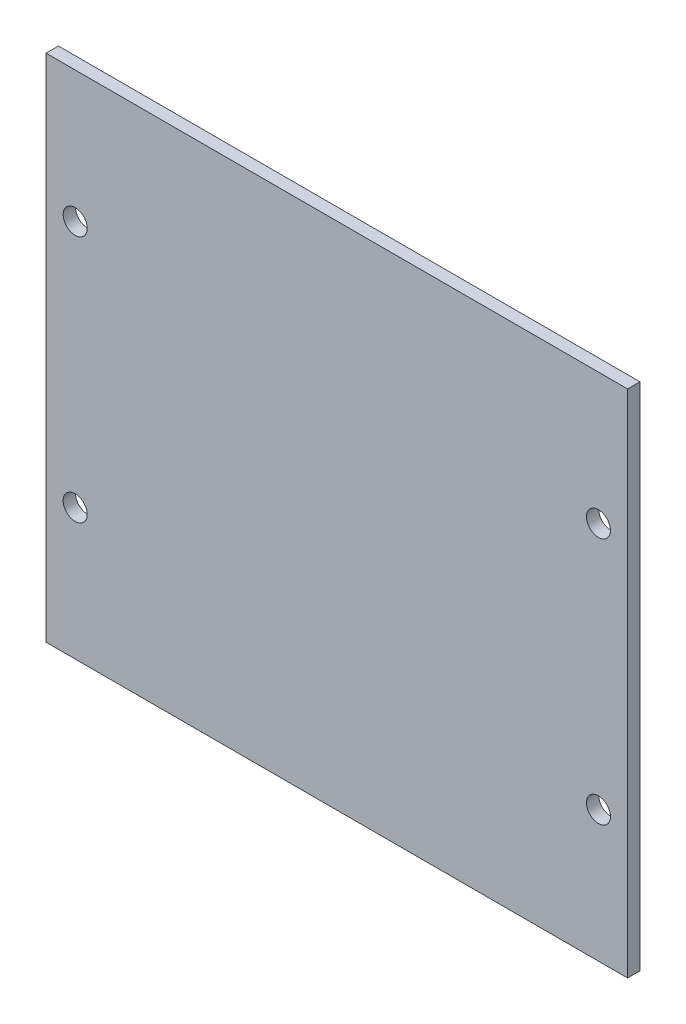
ISO-10303-21;
HEADER;
FILE_DESCRIPTION(('STEP AP214'),'2;1');
FILE_NAME('part.step','',(''),(''),'','','');
FILE_SCHEMA(('AUTOMOTIVE_DESIGN { 1 0 10303 214 1 1 1 1 }'));
ENDSEC;
DATA;
#1=APPLICATION_CONTEXT('core data for automotive mechanical design processes');
#2=APPLICATION_PROTOCOL_DEFINITION('international standard','automotive_design',2000,#1);
#3=PRODUCT_CONTEXT('',#1,'mechanical');
#4=PRODUCT('Part','Part','',(#3));
#5=PRODUCT_RELATED_PRODUCT_CATEGORY('part','',(#4));
#6=PRODUCT_DEFINITION_FORMATION('','',#4);
#7=PRODUCT_DEFINITION_CONTEXT('part definition',#1,'design');
#8=PRODUCT_DEFINITION('design','',#6,#7);
#9=PRODUCT_DEFINITION_SHAPE('','',#8);
#10=(LENGTH_UNIT() NAMED_UNIT(*) SI_UNIT(.MILLI.,.METRE.));
#11=(NAMED_UNIT(*) PLANE_ANGLE_UNIT() SI_UNIT($,.RADIAN.));
#12=(NAMED_UNIT(*) SI_UNIT($,.STERADIAN.) SOLID_ANGLE_UNIT());
#13=UNCERTAINTY_MEASURE_WITH_UNIT(LENGTH_MEASURE(1.E-05),#10,'distance_accuracy_value','');
#14=(GEOMETRIC_REPRESENTATION_CONTEXT(3) GLOBAL_UNCERTAINTY_ASSIGNED_CONTEXT((#13)) GLOBAL_UNIT_ASSIGNED_CONTEXT((#10,
#11,#12)) REPRESENTATION_CONTEXT('',''));
#15=CARTESIAN_POINT('',(0.,0.,0.));
#16=DIRECTION('',(0.,0.,1.));
#17=DIRECTION('',(1.,0.,0.));
#18=AXIS2_PLACEMENT_3D('',#15,#16,#17);
#19=CARTESIAN_POINT('',(0.,0.,0.));
#20=DIRECTION('',(0.,0.,-1.));
#21=DIRECTION('',(-1.,0.,0.));
#22=AXIS2_PLACEMENT_3D('',#19,#20,#21);
#23=PLANE('',#22);
#24=CARTESIAN_POINT('',(-35.9,17.,0.));
#25=DIRECTION('',(0.,0.,1.));
#26=DIRECTION('',(1.,0.,0.));
#27=AXIS2_PLACEMENT_3D('',#24,#25,#26);
#28=CIRCLE('',#27,1.65);
#29=CARTESIAN_POINT('',(-34.25,17.,0.));
#30=VERTEX_POINT('',#29);
#31=EDGE_CURVE('E429',#30,#30,#28,.T.);
#32=ORIENTED_EDGE('',*,*,#31,.T.);
#33=EDGE_LOOP('',(#32));
#34=FACE_BOUND('',#33,.T.);
#35=CARTESIAN_POINT('',(-35.9,-17.,0.));
#36=DIRECTION('',(0.,0.,-1.));
#37=DIRECTION('',(-1.,0.,0.));
#38=AXIS2_PLACEMENT_3D('',#35,#36,#37);
#39=CIRCLE('',#38,1.65);
#40=CARTESIAN_POINT('',(-37.55,-17.,0.));
#41=VERTEX_POINT('',#40);
#42=EDGE_CURVE('E444',#41,#41,#39,.T.);
#43=ORIENTED_EDGE('',*,*,#42,.F.);
#44=EDGE_LOOP('',(#43));
#45=FACE_BOUND('',#44,.T.);
#46=CARTESIAN_POINT('',(35.9,17.,0.));
#47=DIRECTION('',(0.,0.,-1.));
#48=DIRECTION('',(-1.,0.,0.));
#49=AXIS2_PLACEMENT_3D('',#46,#47,#48);
#50=CIRCLE('',#49,1.65);
#51=CARTESIAN_POINT('',(34.25,17.,0.));
#52=VERTEX_POINT('',#51);
#53=EDGE_CURVE('E434',#52,#52,#50,.T.);
#54=ORIENTED_EDGE('',*,*,#53,.F.);
#55=EDGE_LOOP('',(#54));
#56=FACE_BOUND('',#55,.T.);
#57=DIRECTION('',(0.,1.,0.));
#58=VECTOR('',#57,1.);
#59=CARTESIAN_POINT('',(-27.5,-13.95,0.));
#60=LINE('',#59,#58);
#61=CARTESIAN_POINT('',(-27.5,-13.95,0.));
#62=VERTEX_POINT('',#61);
#63=CARTESIAN_POINT('',(-27.5,-11.45,0.));
#64=VERTEX_POINT('',#63);
#65=EDGE_CURVE('E213',#62,#64,#60,.T.);
#66=ORIENTED_EDGE('',*,*,#65,.F.);
#67=DIRECTION('',(1.,0.,0.));
#68=VECTOR('',#67,1.);
#69=CARTESIAN_POINT('',(-27.5,-13.95,0.));
#70=LINE('',#69,#68);
#71=CARTESIAN_POINT('',(27.5,-13.95,0.));
#72=VERTEX_POINT('',#71);
#73=EDGE_CURVE('E192',#62,#72,#70,.T.);
#74=ORIENTED_EDGE('',*,*,#73,.T.);
#75=DIRECTION('',(0.,1.,0.));
#76=VECTOR('',#75,1.);
#77=CARTESIAN_POINT('',(27.5,-13.95,0.));
#78=LINE('',#77,#76);
#79=CARTESIAN_POINT('',(27.5,-11.45,0.));
#80=VERTEX_POINT('',#79);
#81=EDGE_CURVE('E186',#72,#80,#78,.T.);
#82=ORIENTED_EDGE('',*,*,#81,.T.);
#83=DIRECTION('',(1.,0.,0.));
#84=VECTOR('',#83,1.);
#85=CARTESIAN_POINT('',(-27.5,-11.45,0.));
#86=LINE('',#85,#84);
#87=EDGE_CURVE('E190',#64,#80,#86,.T.);
#88=ORIENTED_EDGE('',*,*,#87,.F.);
#89=EDGE_LOOP('',(#66,#74,#82,#88));
#90=FACE_BOUND('',#89,.T.);
#91=DIRECTION('',(1.,0.,0.));
#92=VECTOR('',#91,1.);
#93=CARTESIAN_POINT('',(-39.9,35.,0.));
#94=LINE('',#93,#92);
#95=CARTESIAN_POINT('',(-39.9,35.,0.));
#96=VERTEX_POINT('',#95);
#97=CARTESIAN_POINT('',(39.9,35.,0.));
#98=VERTEX_POINT('',#97);
#99=EDGE_CURVE('E351',#96,#98,#94,.T.);
#100=ORIENTED_EDGE('',*,*,#99,.T.);
#101=DIRECTION('',(0.,-1.,0.));
#102=VECTOR('',#101,1.);
#103=CARTESIAN_POINT('',(39.9,35.,0.));
#104=LINE('',#103,#102);
#105=CARTESIAN_POINT('',(39.9,-35.,0.));
#106=VERTEX_POINT('',#105);
#107=EDGE_CURVE('E381',#98,#106,#104,.T.);
#108=ORIENTED_EDGE('',*,*,#107,.T.);
#109=DIRECTION('',(1.,0.,0.));
#110=VECTOR('',#109,1.);
#111=CARTESIAN_POINT('',(-39.9,-35.,0.));
#112=LINE('',#111,#110);
#113=CARTESIAN_POINT('',(-39.9,-35.,0.));
#114=VERTEX_POINT('',#113);
#115=EDGE_CURVE('E384',#114,#106,#112,.T.);
#116=ORIENTED_EDGE('',*,*,#115,.F.);
#117=DIRECTION('',(0.,-1.,0.));
#118=VECTOR('',#117,1.);
#119=CARTESIAN_POINT('',(-39.9,35.,0.));
#120=LINE('',#119,#118);
#121=EDGE_CURVE('E366',#96,#114,#120,.T.);
#122=ORIENTED_EDGE('',*,*,#121,.F.);
#123=EDGE_LOOP('',(#100,#108,#116,#122));
#124=FACE_BOUND('',#123,.T.);
#125=DIRECTION('',(1.,0.,0.));
#126=VECTOR('',#125,1.);
#127=CARTESIAN_POINT('',(-27.5,13.95,0.));
#128=LINE('',#127,#126);
#129=CARTESIAN_POINT('',(-27.5,13.95,0.));
#130=VERTEX_POINT('',#129);
#131=CARTESIAN_POINT('',(27.5,13.95,0.));
#132=VERTEX_POINT('',#131);
#133=EDGE_CURVE('E322',#130,#132,#128,.T.);
#134=ORIENTED_EDGE('',*,*,#133,.F.);
#135=DIRECTION('',(0.,-1.,0.));
#136=VECTOR('',#135,1.);
#137=CARTESIAN_POINT('',(-27.5,13.95,0.));
#138=LINE('',#137,#136);
#139=CARTESIAN_POINT('',(-27.5,11.45,0.));
#140=VERTEX_POINT('',#139);
#141=EDGE_CURVE('E216',#130,#140,#138,.T.);
#142=ORIENTED_EDGE('',*,*,#141,.T.);
#143=DIRECTION('',(1.,0.,0.));
#144=VECTOR('',#143,1.);
#145=CARTESIAN_POINT('',(-27.5,11.45,0.));
#146=LINE('',#145,#144);
#147=CARTESIAN_POINT('',(27.5,11.45,0.));
#148=VERTEX_POINT('',#147);
#149=EDGE_CURVE('E337',#140,#148,#146,.T.);
#150=ORIENTED_EDGE('',*,*,#149,.T.);
#151=DIRECTION('',(0.,-1.,0.));
#152=VECTOR('',#151,1.);
#153=CARTESIAN_POINT('',(27.5,13.95,0.));
#154=LINE('',#153,#152);
#155=EDGE_CURVE('E340',#132,#148,#154,.T.);
#156=ORIENTED_EDGE('',*,*,#155,.F.);
#157=EDGE_LOOP('',(#134,#142,#150,#156));
#158=FACE_BOUND('',#157,.T.);
#159=DIRECTION('',(1.,0.,0.));
#160=VECTOR('',#159,1.);
#161=CARTESIAN_POINT('',(-27.5,18.95,0.));
#162=LINE('',#161,#160);
#163=CARTESIAN_POINT('',(-27.5,18.95,0.));
#164=VERTEX_POINT('',#163);
#165=CARTESIAN_POINT('',(27.5,18.95,0.));
#166=VERTEX_POINT('',#165);
#167=EDGE_CURVE('E253',#164,#166,#162,.T.);
#168=ORIENTED_EDGE('',*,*,#167,.F.);
#169=DIRECTION('',(0.,-1.,0.));
#170=VECTOR('',#169,1.);
#171=CARTESIAN_POINT('',(-27.5,18.95,0.));
#172=LINE('',#171,#170);
#173=CARTESIAN_POINT('',(-27.5,16.45,0.));
#174=VERTEX_POINT('',#173);
#175=EDGE_CURVE('E263',#164,#174,#172,.T.);
#176=ORIENTED_EDGE('',*,*,#175,.T.);
#177=DIRECTION('',(1.,0.,0.));
#178=VECTOR('',#177,1.);
#179=CARTESIAN_POINT('',(-27.5,16.45,0.));
#180=LINE('',#179,#178);
#181=CARTESIAN_POINT('',(27.5,16.45,0.));
#182=VERTEX_POINT('',#181);
#183=EDGE_CURVE('E257',#174,#182,#180,.T.);
#184=ORIENTED_EDGE('',*,*,#183,.T.);
#185=DIRECTION('',(0.,-1.,0.));
#186=VECTOR('',#185,1.);
#187=CARTESIAN_POINT('',(27.5,18.95,0.));
#188=LINE('',#187,#186);
#189=EDGE_CURVE('E254',#166,#182,#188,.T.);
#190=ORIENTED_EDGE('',*,*,#189,.F.);
#191=EDGE_LOOP('',(#168,#176,#184,#190));
#192=FACE_BOUND('',#191,.T.);
#193=DIRECTION('',(0.,1.,0.));
#194=VECTOR('',#193,1.);
#195=CARTESIAN_POINT('',(-27.5,-18.95,0.));
#196=LINE('',#195,#194);
#197=CARTESIAN_POINT('',(-27.5,-18.95,0.));
#198=VERTEX_POINT('',#197);
#199=CARTESIAN_POINT('',(-27.5,-16.45,0.));
#200=VERTEX_POINT('',#199);
#201=EDGE_CURVE('E294',#198,#200,#196,.T.);
#202=ORIENTED_EDGE('',*,*,#201,.F.);
#203=DIRECTION('',(1.,0.,0.));
#204=VECTOR('',#203,1.);
#205=CARTESIAN_POINT('',(-27.5,-18.95,0.));
#206=LINE('',#205,#204);
#207=CARTESIAN_POINT('',(27.5,-18.95,0.));
#208=VERTEX_POINT('',#207);
#209=EDGE_CURVE('E70',#198,#208,#206,.T.);
#210=ORIENTED_EDGE('',*,*,#209,.T.);
#211=DIRECTION('',(0.,1.,0.));
#212=VECTOR('',#211,1.);
#213=CARTESIAN_POINT('',(27.5,-18.95,0.));
#214=LINE('',#213,#212);
#215=CARTESIAN_POINT('',(27.5,-16.45,0.));
#216=VERTEX_POINT('',#215);
#217=EDGE_CURVE('E75',#208,#216,#214,.T.);
#218=ORIENTED_EDGE('',*,*,#217,.T.);
#219=DIRECTION('',(1.,0.,0.));
#220=VECTOR('',#219,1.);
#221=CARTESIAN_POINT('',(-27.5,-16.45,0.));
#222=LINE('',#221,#220);
#223=EDGE_CURVE('E299',#200,#216,#222,.T.);
#224=ORIENTED_EDGE('',*,*,#223,.F.);
#225=EDGE_LOOP('',(#202,#210,#218,#224));
#226=FACE_BOUND('',#225,.T.);
#227=CARTESIAN_POINT('',(35.9,-17.,0.));
#228=DIRECTION('',(0.,0.,1.));
#229=DIRECTION('',(1.,0.,0.));
#230=AXIS2_PLACEMENT_3D('',#227,#228,#229);
#231=CIRCLE('',#230,1.65);
#232=CARTESIAN_POINT('',(37.55,-17.,0.));
#233=VERTEX_POINT('',#232);
#234=EDGE_CURVE('E427',#233,#233,#231,.T.);
#235=ORIENTED_EDGE('',*,*,#234,.T.);
#236=EDGE_LOOP('',(#235));
#237=FACE_BOUND('',#236,.T.);
#238=ADVANCED_FACE('F47',(#34,#45,#56,#90,#124,#158,#192,#226,#237),#23,.T.);
#239=CARTESIAN_POINT('',(0.,0.,1.7));
#240=DIRECTION('',(0.,0.,-1.));
#241=DIRECTION('',(-1.,0.,0.));
#242=AXIS2_PLACEMENT_3D('',#239,#240,#241);
#243=PLANE('',#242);
#244=CARTESIAN_POINT('',(-35.9,-17.,1.7));
#245=DIRECTION('',(0.,0.,-1.));
#246=DIRECTION('',(-1.,0.,0.));
#247=AXIS2_PLACEMENT_3D('',#244,#245,#246);
#248=CIRCLE('',#247,1.65);
#249=CARTESIAN_POINT('',(-37.55,-17.,1.7));
#250=VERTEX_POINT('',#249);
#251=EDGE_CURVE('E701',#250,#250,#248,.T.);
#252=ORIENTED_EDGE('',*,*,#251,.T.);
#253=EDGE_LOOP('',(#252));
#254=FACE_BOUND('',#253,.T.);
#255=CARTESIAN_POINT('',(35.9,17.,1.7));
#256=DIRECTION('',(0.,0.,-1.));
#257=DIRECTION('',(-1.,0.,0.));
#258=AXIS2_PLACEMENT_3D('',#255,#256,#257);
#259=CIRCLE('',#258,1.65);
#260=CARTESIAN_POINT('',(34.25,17.,1.7));
#261=VERTEX_POINT('',#260);
#262=EDGE_CURVE('E291',#261,#261,#259,.T.);
#263=ORIENTED_EDGE('',*,*,#262,.T.);
#264=EDGE_LOOP('',(#263));
#265=FACE_BOUND('',#264,.T.);
#266=DIRECTION('',(1.,0.,0.));
#267=VECTOR('',#266,1.);
#268=CARTESIAN_POINT('',(-39.9,35.,1.7));
#269=LINE('',#268,#267);
#270=CARTESIAN_POINT('',(-39.9,35.,1.7));
#271=VERTEX_POINT('',#270);
#272=CARTESIAN_POINT('',(39.9,35.,1.7));
#273=VERTEX_POINT('',#272);
#274=EDGE_CURVE('E361',#271,#273,#269,.T.);
#275=ORIENTED_EDGE('',*,*,#274,.F.);
#276=DIRECTION('',(0.,-1.,0.));
#277=VECTOR('',#276,1.);
#278=CARTESIAN_POINT('',(-39.9,35.,1.7));
#279=LINE('',#278,#277);
#280=CARTESIAN_POINT('',(-39.9,-35.,1.7));
#281=VERTEX_POINT('',#280);
#282=EDGE_CURVE('E374',#271,#281,#279,.T.);
#283=ORIENTED_EDGE('',*,*,#282,.T.);
#284=DIRECTION('',(1.,0.,0.));
#285=VECTOR('',#284,1.);
#286=CARTESIAN_POINT('',(-39.9,-35.,1.7));
#287=LINE('',#286,#285);
#288=CARTESIAN_POINT('',(39.9,-35.,1.7));
#289=VERTEX_POINT('',#288);
#290=EDGE_CURVE('E375',#281,#289,#287,.T.);
#291=ORIENTED_EDGE('',*,*,#290,.T.);
#292=DIRECTION('',(0.,-1.,0.));
#293=VECTOR('',#292,1.);
#294=CARTESIAN_POINT('',(39.9,35.,1.7));
#295=LINE('',#294,#293);
#296=EDGE_CURVE('E370',#273,#289,#295,.T.);
#297=ORIENTED_EDGE('',*,*,#296,.F.);
#298=EDGE_LOOP('',(#275,#283,#291,#297));
#299=FACE_BOUND('',#298,.T.);
#300=CARTESIAN_POINT('',(-35.9,17.,1.7));
#301=DIRECTION('',(0.,0.,1.));
#302=DIRECTION('',(1.,0.,0.));
#303=AXIS2_PLACEMENT_3D('',#300,#301,#302);
#304=CIRCLE('',#303,1.65);
#305=CARTESIAN_POINT('',(-34.25,17.,1.7));
#306=VERTEX_POINT('',#305);
#307=EDGE_CURVE('E421',#306,#306,#304,.T.);
#308=ORIENTED_EDGE('',*,*,#307,.F.);
#309=EDGE_LOOP('',(#308));
#310=FACE_BOUND('',#309,.T.);
#311=CARTESIAN_POINT('',(35.9,-17.,1.7));
#312=DIRECTION('',(0.,0.,1.));
#313=DIRECTION('',(1.,0.,0.));
#314=AXIS2_PLACEMENT_3D('',#311,#312,#313);
#315=CIRCLE('',#314,1.65);
#316=CARTESIAN_POINT('',(37.55,-17.,1.7));
#317=VERTEX_POINT('',#316);
#318=EDGE_CURVE('E426',#317,#317,#315,.T.);
#319=ORIENTED_EDGE('',*,*,#318,.F.);
#320=EDGE_LOOP('',(#319));
#321=FACE_BOUND('',#320,.T.);
#322=ADVANCED_FACE('F414',(#254,#265,#299,#310,#321),#243,.F.);
#323=CARTESIAN_POINT('',(-39.9,35.,1.7));
#324=DIRECTION('',(0.,1.,0.));
#325=DIRECTION('',(-1.,0.,0.));
#326=AXIS2_PLACEMENT_3D('',#323,#324,#325);
#327=PLANE('',#326);
#328=ORIENTED_EDGE('',*,*,#99,.F.);
#329=DIRECTION('',(0.,0.,-1.));
#330=VECTOR('',#329,1.);
#331=CARTESIAN_POINT('',(-39.9,35.,1.7));
#332=LINE('',#331,#330);
#333=EDGE_CURVE('E11',#271,#96,#332,.T.);
#334=ORIENTED_EDGE('',*,*,#333,.F.);
#335=ORIENTED_EDGE('',*,*,#274,.T.);
#336=DIRECTION('',(0.,0.,-1.));
#337=VECTOR('',#336,1.);
#338=CARTESIAN_POINT('',(39.9,35.,1.7));
#339=LINE('',#338,#337);
#340=EDGE_CURVE('E52',#273,#98,#339,.T.);
#341=ORIENTED_EDGE('',*,*,#340,.T.);
#342=EDGE_LOOP('',(#328,#334,#335,#341));
#343=FACE_BOUND('',#342,.T.);
#344=ADVANCED_FACE('F51',(#343),#327,.T.);
#345=CARTESIAN_POINT('',(-39.9,35.,1.7));
#346=DIRECTION('',(1.,0.,0.));
#347=DIRECTION('',(0.,1.,0.));
#348=AXIS2_PLACEMENT_3D('',#345,#346,#347);
#349=PLANE('',#348);
#350=ORIENTED_EDGE('',*,*,#121,.T.);
#351=DIRECTION('',(0.,0.,-1.));
#352=VECTOR('',#351,1.);
#353=CARTESIAN_POINT('',(-39.9,-35.,1.7));
#354=LINE('',#353,#352);
#355=EDGE_CURVE('E56',#281,#114,#354,.T.);
#356=ORIENTED_EDGE('',*,*,#355,.F.);
#357=ORIENTED_EDGE('',*,*,#282,.F.);
#358=ORIENTED_EDGE('',*,*,#333,.T.);
#359=EDGE_LOOP('',(#350,#356,#357,#358));
#360=FACE_BOUND('',#359,.T.);
#361=ADVANCED_FACE('F408',(#360),#349,.F.);
#362=CARTESIAN_POINT('',(-39.9,-35.,1.7));
#363=DIRECTION('',(0.,1.,0.));
#364=DIRECTION('',(-1.,0.,0.));
#365=AXIS2_PLACEMENT_3D('',#362,#363,#364);
#366=PLANE('',#365);
#367=ORIENTED_EDGE('',*,*,#115,.T.);
#368=DIRECTION('',(0.,0.,-1.));
#369=VECTOR('',#368,1.);
#370=CARTESIAN_POINT('',(39.9,-35.,1.7));
#371=LINE('',#370,#369);
#372=EDGE_CURVE('E394',#289,#106,#371,.T.);
#373=ORIENTED_EDGE('',*,*,#372,.F.);
#374=ORIENTED_EDGE('',*,*,#290,.F.);
#375=ORIENTED_EDGE('',*,*,#355,.T.);
#376=EDGE_LOOP('',(#367,#373,#374,#375));
#377=FACE_BOUND('',#376,.T.);
#378=ADVANCED_FACE('F412',(#377),#366,.F.);
#379=CARTESIAN_POINT('',(39.9,35.,1.7));
#380=DIRECTION('',(1.,0.,0.));
#381=DIRECTION('',(0.,1.,0.));
#382=AXIS2_PLACEMENT_3D('',#379,#380,#381);
#383=PLANE('',#382);
#384=ORIENTED_EDGE('',*,*,#107,.F.);
#385=ORIENTED_EDGE('',*,*,#340,.F.);
#386=ORIENTED_EDGE('',*,*,#296,.T.);
#387=ORIENTED_EDGE('',*,*,#372,.T.);
#388=EDGE_LOOP('',(#384,#385,#386,#387));
#389=FACE_BOUND('',#388,.T.);
#390=ADVANCED_FACE('F401',(#389),#383,.T.);
#391=CARTESIAN_POINT('',(-27.5,13.95,-9.5));
#392=DIRECTION('',(-1.,0.,0.));
#393=DIRECTION('',(0.,0.,1.));
#394=AXIS2_PLACEMENT_3D('',#391,#392,#393);
#395=PLANE('',#394);
#396=ORIENTED_EDGE('',*,*,#141,.F.);
#397=DIRECTION('',(0.,0.,1.));
#398=VECTOR('',#397,1.);
#399=CARTESIAN_POINT('',(-27.5,13.95,-9.5));
#400=LINE('',#399,#398);
#401=CARTESIAN_POINT('',(-27.5,13.95,-9.5));
#402=VERTEX_POINT('',#401);
#403=EDGE_CURVE('E350',#402,#130,#400,.T.);
#404=ORIENTED_EDGE('',*,*,#403,.F.);
#405=DIRECTION('',(0.,-1.,0.));
#406=VECTOR('',#405,1.);
#407=CARTESIAN_POINT('',(-27.5,13.95,-9.5));
#408=LINE('',#407,#406);
#409=CARTESIAN_POINT('',(-27.5,11.45,-9.5));
#410=VERTEX_POINT('',#409);
#411=EDGE_CURVE('E317',#402,#410,#408,.T.);
#412=ORIENTED_EDGE('',*,*,#411,.T.);
#413=DIRECTION('',(0.,0.,1.));
#414=VECTOR('',#413,1.);
#415=CARTESIAN_POINT('',(-27.5,11.45,-9.5));
#416=LINE('',#415,#414);
#417=EDGE_CURVE('E331',#410,#140,#416,.T.);
#418=ORIENTED_EDGE('',*,*,#417,.T.);
#419=EDGE_LOOP('',(#396,#404,#412,#418));
#420=FACE_BOUND('',#419,.T.);
#421=ADVANCED_FACE('F488',(#420),#395,.T.);
#422=CARTESIAN_POINT('',(-27.5,13.95,-9.5));
#423=DIRECTION('',(0.,-1.,0.));
#424=DIRECTION('',(1.,0.,0.));
#425=AXIS2_PLACEMENT_3D('',#422,#423,#424);
#426=PLANE('',#425);
#427=ORIENTED_EDGE('',*,*,#133,.T.);
#428=DIRECTION('',(0.,0.,1.));
#429=VECTOR('',#428,1.);
#430=CARTESIAN_POINT('',(27.5,13.95,-9.5));
#431=LINE('',#430,#429);
#432=CARTESIAN_POINT('',(27.5,13.95,-9.5));
#433=VERTEX_POINT('',#432);
#434=EDGE_CURVE('E352',#433,#132,#431,.T.);
#435=ORIENTED_EDGE('',*,*,#434,.F.);
#436=DIRECTION('',(1.,0.,0.));
#437=VECTOR('',#436,1.);
#438=CARTESIAN_POINT('',(-27.5,13.95,-9.5));
#439=LINE('',#438,#437);
#440=EDGE_CURVE('E332',#402,#433,#439,.T.);
#441=ORIENTED_EDGE('',*,*,#440,.F.);
#442=ORIENTED_EDGE('',*,*,#403,.T.);
#443=EDGE_LOOP('',(#427,#435,#441,#442));
#444=FACE_BOUND('',#443,.T.);
#445=ADVANCED_FACE('F495',(#444),#426,.F.);
#446=CARTESIAN_POINT('',(27.5,13.95,-9.5));
#447=DIRECTION('',(-1.,0.,0.));
#448=DIRECTION('',(0.,0.,1.));
#449=AXIS2_PLACEMENT_3D('',#446,#447,#448);
#450=PLANE('',#449);
#451=ORIENTED_EDGE('',*,*,#155,.T.);
#452=DIRECTION('',(0.,0.,1.));
#453=VECTOR('',#452,1.);
#454=CARTESIAN_POINT('',(27.5,11.45,-9.5));
#455=LINE('',#454,#453);
#456=CARTESIAN_POINT('',(27.5,11.45,-9.5));
#457=VERTEX_POINT('',#456);
#458=EDGE_CURVE('E356',#457,#148,#455,.T.);
#459=ORIENTED_EDGE('',*,*,#458,.F.);
#460=DIRECTION('',(0.,-1.,0.));
#461=VECTOR('',#460,1.);
#462=CARTESIAN_POINT('',(27.5,13.95,-9.5));
#463=LINE('',#462,#461);
#464=EDGE_CURVE('E327',#433,#457,#463,.T.);
#465=ORIENTED_EDGE('',*,*,#464,.F.);
#466=ORIENTED_EDGE('',*,*,#434,.T.);
#467=EDGE_LOOP('',(#451,#459,#465,#466));
#468=FACE_BOUND('',#467,.T.);
#469=ADVANCED_FACE('F500',(#468),#450,.F.);
#470=CARTESIAN_POINT('',(-27.5,11.45,-9.5));
#471=DIRECTION('',(0.,-1.,0.));
#472=DIRECTION('',(0.,0.,-1.));
#473=AXIS2_PLACEMENT_3D('',#470,#471,#472);
#474=PLANE('',#473);
#475=ORIENTED_EDGE('',*,*,#149,.F.);
#476=ORIENTED_EDGE('',*,*,#417,.F.);
#477=DIRECTION('',(1.,0.,0.));
#478=VECTOR('',#477,1.);
#479=CARTESIAN_POINT('',(-27.5,11.45,-9.5));
#480=LINE('',#479,#478);
#481=EDGE_CURVE('E323',#410,#457,#480,.T.);
#482=ORIENTED_EDGE('',*,*,#481,.T.);
#483=ORIENTED_EDGE('',*,*,#458,.T.);
#484=EDGE_LOOP('',(#475,#476,#482,#483));
#485=FACE_BOUND('',#484,.T.);
#486=ADVANCED_FACE('F502',(#485),#474,.T.);
#487=CARTESIAN_POINT('',(0.,0.,-9.5));
#488=DIRECTION('',(0.,0.,1.));
#489=DIRECTION('',(1.,0.,0.));
#490=AXIS2_PLACEMENT_3D('',#487,#488,#489);
#491=PLANE('',#490);
#492=ORIENTED_EDGE('',*,*,#411,.F.);
#493=ORIENTED_EDGE('',*,*,#440,.T.);
#494=ORIENTED_EDGE('',*,*,#464,.T.);
#495=ORIENTED_EDGE('',*,*,#481,.F.);
#496=EDGE_LOOP('',(#492,#493,#494,#495));
#497=FACE_BOUND('',#496,.T.);
#498=ADVANCED_FACE('F505',(#497),#491,.F.);
#499=CARTESIAN_POINT('',(-27.5,-13.95,-9.5));
#500=DIRECTION('',(1.,0.,0.));
#501=DIRECTION('',(0.,0.,-1.));
#502=AXIS2_PLACEMENT_3D('',#499,#500,#501);
#503=PLANE('',#502);
#504=ORIENTED_EDGE('',*,*,#65,.T.);
#505=DIRECTION('',(0.,0.,1.));
#506=VECTOR('',#505,1.);
#507=CARTESIAN_POINT('',(-27.5,-11.45,-9.5));
#508=LINE('',#507,#506);
#509=CARTESIAN_POINT('',(-27.5,-11.45,-9.5));
#510=VERTEX_POINT('',#509);
#511=EDGE_CURVE('E210',#510,#64,#508,.T.);
#512=ORIENTED_EDGE('',*,*,#511,.F.);
#513=DIRECTION('',(0.,1.,0.));
#514=VECTOR('',#513,1.);
#515=CARTESIAN_POINT('',(-27.5,-13.95,-9.5));
#516=LINE('',#515,#514);
#517=CARTESIAN_POINT('',(-27.5,-13.95,-9.5));
#518=VERTEX_POINT('',#517);
#519=EDGE_CURVE('E230',#518,#510,#516,.T.);
#520=ORIENTED_EDGE('',*,*,#519,.F.);
#521=DIRECTION('',(0.,0.,1.));
#522=VECTOR('',#521,1.);
#523=CARTESIAN_POINT('',(-27.5,-13.95,-9.5));
#524=LINE('',#523,#522);
#525=EDGE_CURVE('E221',#518,#62,#524,.T.);
#526=ORIENTED_EDGE('',*,*,#525,.T.);
#527=EDGE_LOOP('',(#504,#512,#520,#526));
#528=FACE_BOUND('',#527,.T.);
#529=ADVANCED_FACE('F459',(#528),#503,.F.);
#530=CARTESIAN_POINT('',(-27.5,-11.45,-9.5));
#531=DIRECTION('',(0.,-1.,0.));
#532=DIRECTION('',(0.,0.,-1.));
#533=AXIS2_PLACEMENT_3D('',#530,#531,#532);
#534=PLANE('',#533);
#535=ORIENTED_EDGE('',*,*,#87,.T.);
#536=DIRECTION('',(0.,0.,1.));
#537=VECTOR('',#536,1.);
#538=CARTESIAN_POINT('',(27.5,-11.45,-9.5));
#539=LINE('',#538,#537);
#540=CARTESIAN_POINT('',(27.5,-11.45,-9.5));
#541=VERTEX_POINT('',#540);
#542=EDGE_CURVE('E199',#541,#80,#539,.T.);
#543=ORIENTED_EDGE('',*,*,#542,.F.);
#544=DIRECTION('',(1.,0.,0.));
#545=VECTOR('',#544,1.);
#546=CARTESIAN_POINT('',(-27.5,-11.45,-9.5));
#547=LINE('',#546,#545);
#548=EDGE_CURVE('E227',#510,#541,#547,.T.);
#549=ORIENTED_EDGE('',*,*,#548,.F.);
#550=ORIENTED_EDGE('',*,*,#511,.T.);
#551=EDGE_LOOP('',(#535,#543,#549,#550));
#552=FACE_BOUND('',#551,.T.);
#553=ADVANCED_FACE('F207',(#552),#534,.F.);
#554=CARTESIAN_POINT('',(27.5,-13.95,-9.5));
#555=DIRECTION('',(1.,0.,0.));
#556=DIRECTION('',(0.,0.,-1.));
#557=AXIS2_PLACEMENT_3D('',#554,#555,#556);
#558=PLANE('',#557);
#559=ORIENTED_EDGE('',*,*,#81,.F.);
#560=DIRECTION('',(0.,0.,1.));
#561=VECTOR('',#560,1.);
#562=CARTESIAN_POINT('',(27.5,-13.95,-9.5));
#563=LINE('',#562,#561);
#564=CARTESIAN_POINT('',(27.5,-13.95,-9.5));
#565=VERTEX_POINT('',#564);
#566=EDGE_CURVE('E206',#565,#72,#563,.T.);
#567=ORIENTED_EDGE('',*,*,#566,.F.);
#568=DIRECTION('',(0.,1.,0.));
#569=VECTOR('',#568,1.);
#570=CARTESIAN_POINT('',(27.5,-13.95,-9.5));
#571=LINE('',#570,#569);
#572=EDGE_CURVE('E201',#565,#541,#571,.T.);
#573=ORIENTED_EDGE('',*,*,#572,.T.);
#574=ORIENTED_EDGE('',*,*,#542,.T.);
#575=EDGE_LOOP('',(#559,#567,#573,#574));
#576=FACE_BOUND('',#575,.T.);
#577=ADVANCED_FACE('F203',(#576),#558,.T.);
#578=CARTESIAN_POINT('',(-27.5,-13.95,-9.5));
#579=DIRECTION('',(0.,-1.,0.));
#580=DIRECTION('',(1.,0.,0.));
#581=AXIS2_PLACEMENT_3D('',#578,#579,#580);
#582=PLANE('',#581);
#583=ORIENTED_EDGE('',*,*,#73,.F.);
#584=ORIENTED_EDGE('',*,*,#525,.F.);
#585=DIRECTION('',(1.,0.,0.));
#586=VECTOR('',#585,1.);
#587=CARTESIAN_POINT('',(-27.5,-13.95,-9.5));
#588=LINE('',#587,#586);
#589=EDGE_CURVE('E219',#518,#565,#588,.T.);
#590=ORIENTED_EDGE('',*,*,#589,.T.);
#591=ORIENTED_EDGE('',*,*,#566,.T.);
#592=EDGE_LOOP('',(#583,#584,#590,#591));
#593=FACE_BOUND('',#592,.T.);
#594=ADVANCED_FACE('F462',(#593),#582,.T.);
#595=CARTESIAN_POINT('',(0.,0.,-9.5));
#596=DIRECTION('',(0.,0.,-1.));
#597=DIRECTION('',(-1.,0.,0.));
#598=AXIS2_PLACEMENT_3D('',#595,#596,#597);
#599=PLANE('',#598);
#600=ORIENTED_EDGE('',*,*,#519,.T.);
#601=ORIENTED_EDGE('',*,*,#548,.T.);
#602=ORIENTED_EDGE('',*,*,#572,.F.);
#603=ORIENTED_EDGE('',*,*,#589,.F.);
#604=EDGE_LOOP('',(#600,#601,#602,#603));
#605=FACE_BOUND('',#604,.T.);
#606=ADVANCED_FACE('F463',(#605),#599,.T.);
#607=CARTESIAN_POINT('',(-27.5,18.95,-9.5));
#608=DIRECTION('',(-1.,0.,0.));
#609=DIRECTION('',(0.,0.,1.));
#610=AXIS2_PLACEMENT_3D('',#607,#608,#609);
#611=PLANE('',#610);
#612=ORIENTED_EDGE('',*,*,#175,.F.);
#613=DIRECTION('',(0.,0.,1.));
#614=VECTOR('',#613,1.);
#615=CARTESIAN_POINT('',(-27.5,18.95,-9.5));
#616=LINE('',#615,#614);
#617=CARTESIAN_POINT('',(-27.5,18.95,-9.5));
#618=VERTEX_POINT('',#617);
#619=EDGE_CURVE('E250',#618,#164,#616,.T.);
#620=ORIENTED_EDGE('',*,*,#619,.F.);
#621=DIRECTION('',(0.,-1.,0.));
#622=VECTOR('',#621,1.);
#623=CARTESIAN_POINT('',(-27.5,18.95,-9.5));
#624=LINE('',#623,#622);
#625=CARTESIAN_POINT('',(-27.5,16.45,-9.5));
#626=VERTEX_POINT('',#625);
#627=EDGE_CURVE('E258',#618,#626,#624,.T.);
#628=ORIENTED_EDGE('',*,*,#627,.T.);
#629=DIRECTION('',(0.,0.,1.));
#630=VECTOR('',#629,1.);
#631=CARTESIAN_POINT('',(-27.5,16.45,-9.5));
#632=LINE('',#631,#630);
#633=EDGE_CURVE('E233',#626,#174,#632,.T.);
#634=ORIENTED_EDGE('',*,*,#633,.T.);
#635=EDGE_LOOP('',(#612,#620,#628,#634));
#636=FACE_BOUND('',#635,.T.);
#637=ADVANCED_FACE('F466',(#636),#611,.T.);
#638=CARTESIAN_POINT('',(-27.5,18.95,-9.5));
#639=DIRECTION('',(0.,-1.,0.));
#640=DIRECTION('',(1.,0.,0.));
#641=AXIS2_PLACEMENT_3D('',#638,#639,#640);
#642=PLANE('',#641);
#643=ORIENTED_EDGE('',*,*,#167,.T.);
#644=DIRECTION('',(0.,0.,1.));
#645=VECTOR('',#644,1.);
#646=CARTESIAN_POINT('',(27.5,18.95,-9.5));
#647=LINE('',#646,#645);
#648=CARTESIAN_POINT('',(27.5,18.95,-9.5));
#649=VERTEX_POINT('',#648);
#650=EDGE_CURVE('E244',#649,#166,#647,.T.);
#651=ORIENTED_EDGE('',*,*,#650,.F.);
#652=DIRECTION('',(1.,0.,0.));
#653=VECTOR('',#652,1.);
#654=CARTESIAN_POINT('',(-27.5,18.95,-9.5));
#655=LINE('',#654,#653);
#656=EDGE_CURVE('E236',#618,#649,#655,.T.);
#657=ORIENTED_EDGE('',*,*,#656,.F.);
#658=ORIENTED_EDGE('',*,*,#619,.T.);
#659=EDGE_LOOP('',(#643,#651,#657,#658));
#660=FACE_BOUND('',#659,.T.);
#661=ADVANCED_FACE('F472',(#660),#642,.F.);
#662=CARTESIAN_POINT('',(27.5,18.95,-9.5));
#663=DIRECTION('',(-1.,0.,0.));
#664=DIRECTION('',(0.,0.,1.));
#665=AXIS2_PLACEMENT_3D('',#662,#663,#664);
#666=PLANE('',#665);
#667=ORIENTED_EDGE('',*,*,#189,.T.);
#668=DIRECTION('',(0.,0.,1.));
#669=VECTOR('',#668,1.);
#670=CARTESIAN_POINT('',(27.5,16.45,-9.5));
#671=LINE('',#670,#669);
#672=CARTESIAN_POINT('',(27.5,16.45,-9.5));
#673=VERTEX_POINT('',#672);
#674=EDGE_CURVE('E239',#673,#182,#671,.T.);
#675=ORIENTED_EDGE('',*,*,#674,.F.);
#676=DIRECTION('',(0.,-1.,0.));
#677=VECTOR('',#676,1.);
#678=CARTESIAN_POINT('',(27.5,18.95,-9.5));
#679=LINE('',#678,#677);
#680=EDGE_CURVE('E268',#649,#673,#679,.T.);
#681=ORIENTED_EDGE('',*,*,#680,.F.);
#682=ORIENTED_EDGE('',*,*,#650,.T.);
#683=EDGE_LOOP('',(#667,#675,#681,#682));
#684=FACE_BOUND('',#683,.T.);
#685=ADVANCED_FACE('F541',(#684),#666,.F.);
#686=CARTESIAN_POINT('',(-27.5,16.45,-9.5));
#687=DIRECTION('',(0.,-1.,0.));
#688=DIRECTION('',(1.,0.,0.));
#689=AXIS2_PLACEMENT_3D('',#686,#687,#688);
#690=PLANE('',#689);
#691=ORIENTED_EDGE('',*,*,#183,.F.);
#692=ORIENTED_EDGE('',*,*,#633,.F.);
#693=DIRECTION('',(1.,0.,0.));
#694=VECTOR('',#693,1.);
#695=CARTESIAN_POINT('',(-27.5,16.45,-9.5));
#696=LINE('',#695,#694);
#697=EDGE_CURVE('E271',#626,#673,#696,.T.);
#698=ORIENTED_EDGE('',*,*,#697,.T.);
#699=ORIENTED_EDGE('',*,*,#674,.T.);
#700=EDGE_LOOP('',(#691,#692,#698,#699));
#701=FACE_BOUND('',#700,.T.);
#702=ADVANCED_FACE('F540',(#701),#690,.T.);
#703=CARTESIAN_POINT('',(0.,0.,-9.5));
#704=DIRECTION('',(0.,0.,1.));
#705=DIRECTION('',(1.,0.,0.));
#706=AXIS2_PLACEMENT_3D('',#703,#704,#705);
#707=PLANE('',#706);
#708=ORIENTED_EDGE('',*,*,#627,.F.);
#709=ORIENTED_EDGE('',*,*,#656,.T.);
#710=ORIENTED_EDGE('',*,*,#680,.T.);
#711=ORIENTED_EDGE('',*,*,#697,.F.);
#712=EDGE_LOOP('',(#708,#709,#710,#711));
#713=FACE_BOUND('',#712,.T.);
#714=ADVANCED_FACE('F531',(#713),#707,.F.);
#715=CARTESIAN_POINT('',(-27.5,-18.95,-9.5));
#716=DIRECTION('',(0.,-1.,0.));
#717=DIRECTION('',(1.,0.,0.));
#718=AXIS2_PLACEMENT_3D('',#715,#716,#717);
#719=PLANE('',#718);
#720=ORIENTED_EDGE('',*,*,#209,.F.);
#721=DIRECTION('',(0.,0.,1.));
#722=VECTOR('',#721,1.);
#723=CARTESIAN_POINT('',(-27.5,-18.95,-9.5));
#724=LINE('',#723,#722);
#725=CARTESIAN_POINT('',(-27.5,-18.95,-9.5));
#726=VERTEX_POINT('',#725);
#727=EDGE_CURVE('E288',#726,#198,#724,.T.);
#728=ORIENTED_EDGE('',*,*,#727,.F.);
#729=DIRECTION('',(1.,0.,0.));
#730=VECTOR('',#729,1.);
#731=CARTESIAN_POINT('',(-27.5,-18.95,-9.5));
#732=LINE('',#731,#730);
#733=CARTESIAN_POINT('',(27.5,-18.95,-9.5));
#734=VERTEX_POINT('',#733);
#735=EDGE_CURVE('E298',#726,#734,#732,.T.);
#736=ORIENTED_EDGE('',*,*,#735,.T.);
#737=DIRECTION('',(0.,0.,1.));
#738=VECTOR('',#737,1.);
#739=CARTESIAN_POINT('',(27.5,-18.95,-9.5));
#740=LINE('',#739,#738);
#741=EDGE_CURVE('E279',#734,#208,#740,.T.);
#742=ORIENTED_EDGE('',*,*,#741,.T.);
#743=EDGE_LOOP('',(#720,#728,#736,#742));
#744=FACE_BOUND('',#743,.T.);
#745=ADVANCED_FACE('F522',(#744),#719,.T.);
#746=CARTESIAN_POINT('',(-27.5,-18.95,-9.5));
#747=DIRECTION('',(1.,0.,0.));
#748=DIRECTION('',(0.,0.,-1.));
#749=AXIS2_PLACEMENT_3D('',#746,#747,#748);
#750=PLANE('',#749);
#751=ORIENTED_EDGE('',*,*,#201,.T.);
#752=DIRECTION('',(0.,0.,1.));
#753=VECTOR('',#752,1.);
#754=CARTESIAN_POINT('',(-27.5,-16.45,-9.5));
#755=LINE('',#754,#753);
#756=CARTESIAN_POINT('',(-27.5,-16.45,-9.5));
#757=VERTEX_POINT('',#756);
#758=EDGE_CURVE('E285',#757,#200,#755,.T.);
#759=ORIENTED_EDGE('',*,*,#758,.F.);
#760=DIRECTION('',(0.,1.,0.));
#761=VECTOR('',#760,1.);
#762=CARTESIAN_POINT('',(-27.5,-18.95,-9.5));
#763=LINE('',#762,#761);
#764=EDGE_CURVE('E281',#726,#757,#763,.T.);
#765=ORIENTED_EDGE('',*,*,#764,.F.);
#766=ORIENTED_EDGE('',*,*,#727,.T.);
#767=EDGE_LOOP('',(#751,#759,#765,#766));
#768=FACE_BOUND('',#767,.T.);
#769=ADVANCED_FACE('F518',(#768),#750,.F.);
#770=CARTESIAN_POINT('',(-27.5,-16.45,-9.5));
#771=DIRECTION('',(0.,-1.,0.));
#772=DIRECTION('',(1.,0.,0.));
#773=AXIS2_PLACEMENT_3D('',#770,#771,#772);
#774=PLANE('',#773);
#775=ORIENTED_EDGE('',*,*,#223,.T.);
#776=DIRECTION('',(0.,0.,1.));
#777=VECTOR('',#776,1.);
#778=CARTESIAN_POINT('',(27.5,-16.45,-9.5));
#779=LINE('',#778,#777);
#780=CARTESIAN_POINT('',(27.5,-16.45,-9.5));
#781=VERTEX_POINT('',#780);
#782=EDGE_CURVE('E282',#781,#216,#779,.T.);
#783=ORIENTED_EDGE('',*,*,#782,.F.);
#784=DIRECTION('',(1.,0.,0.));
#785=VECTOR('',#784,1.);
#786=CARTESIAN_POINT('',(-27.5,-16.45,-9.5));
#787=LINE('',#786,#785);
#788=EDGE_CURVE('E310',#757,#781,#787,.T.);
#789=ORIENTED_EDGE('',*,*,#788,.F.);
#790=ORIENTED_EDGE('',*,*,#758,.T.);
#791=EDGE_LOOP('',(#775,#783,#789,#790));
#792=FACE_BOUND('',#791,.T.);
#793=ADVANCED_FACE('F525',(#792),#774,.F.);
#794=CARTESIAN_POINT('',(27.5,-18.95,-9.5));
#795=DIRECTION('',(1.,0.,0.));
#796=DIRECTION('',(0.,0.,-1.));
#797=AXIS2_PLACEMENT_3D('',#794,#795,#796);
#798=PLANE('',#797);
#799=ORIENTED_EDGE('',*,*,#217,.F.);
#800=ORIENTED_EDGE('',*,*,#741,.F.);
#801=DIRECTION('',(0.,1.,0.));
#802=VECTOR('',#801,1.);
#803=CARTESIAN_POINT('',(27.5,-18.95,-9.5));
#804=LINE('',#803,#802);
#805=EDGE_CURVE('E315',#734,#781,#804,.T.);
#806=ORIENTED_EDGE('',*,*,#805,.T.);
#807=ORIENTED_EDGE('',*,*,#782,.T.);
#808=EDGE_LOOP('',(#799,#800,#806,#807));
#809=FACE_BOUND('',#808,.T.);
#810=ADVANCED_FACE('F517',(#809),#798,.T.);
#811=CARTESIAN_POINT('',(0.,0.,-9.5));
#812=DIRECTION('',(0.,0.,1.));
#813=DIRECTION('',(1.,0.,0.));
#814=AXIS2_PLACEMENT_3D('',#811,#812,#813);
#815=PLANE('',#814);
#816=ORIENTED_EDGE('',*,*,#735,.F.);
#817=ORIENTED_EDGE('',*,*,#764,.T.);
#818=ORIENTED_EDGE('',*,*,#788,.T.);
#819=ORIENTED_EDGE('',*,*,#805,.F.);
#820=EDGE_LOOP('',(#816,#817,#818,#819));
#821=FACE_BOUND('',#820,.T.);
#822=ADVANCED_FACE('F511',(#821),#815,.F.);
#823=CARTESIAN_POINT('',(35.9,17.,1.7));
#824=DIRECTION('',(0.,0.,-1.));
#825=DIRECTION('',(-1.,0.,0.));
#826=AXIS2_PLACEMENT_3D('',#823,#824,#825);
#827=CYLINDRICAL_SURFACE('',#826,1.65);
#828=ORIENTED_EDGE('',*,*,#262,.F.);
#829=EDGE_LOOP('',(#828));
#830=FACE_BOUND('',#829,.T.);
#831=ORIENTED_EDGE('',*,*,#53,.T.);
#832=EDGE_LOOP('',(#831));
#833=FACE_BOUND('',#832,.T.);
#834=ADVANCED_FACE('F516',(#830,#833),#827,.F.);
#835=CARTESIAN_POINT('',(-35.9,-17.,1.7));
#836=DIRECTION('',(0.,0.,-1.));
#837=DIRECTION('',(-1.,0.,0.));
#838=AXIS2_PLACEMENT_3D('',#835,#836,#837);
#839=CYLINDRICAL_SURFACE('',#838,1.65);
#840=ORIENTED_EDGE('',*,*,#251,.F.);
#841=EDGE_LOOP('',(#840));
#842=FACE_BOUND('',#841,.T.);
#843=ORIENTED_EDGE('',*,*,#42,.T.);
#844=EDGE_LOOP('',(#843));
#845=FACE_BOUND('',#844,.T.);
#846=ADVANCED_FACE('F569',(#842,#845),#839,.F.);
#847=CARTESIAN_POINT('',(-35.9,17.,1.7));
#848=DIRECTION('',(0.,0.,-1.));
#849=DIRECTION('',(-1.,0.,0.));
#850=AXIS2_PLACEMENT_3D('',#847,#848,#849);
#851=CYLINDRICAL_SURFACE('',#850,1.65);
#852=ORIENTED_EDGE('',*,*,#307,.T.);
#853=EDGE_LOOP('',(#852));
#854=FACE_BOUND('',#853,.T.);
#855=ORIENTED_EDGE('',*,*,#31,.F.);
#856=EDGE_LOOP('',(#855));
#857=FACE_BOUND('',#856,.T.);
#858=ADVANCED_FACE('F563',(#854,#857),#851,.F.);
#859=CARTESIAN_POINT('',(35.9,-17.,1.7));
#860=DIRECTION('',(0.,0.,-1.));
#861=DIRECTION('',(-1.,0.,0.));
#862=AXIS2_PLACEMENT_3D('',#859,#860,#861);
#863=CYLINDRICAL_SURFACE('',#862,1.65);
#864=ORIENTED_EDGE('',*,*,#318,.T.);
#865=EDGE_LOOP('',(#864));
#866=FACE_BOUND('',#865,.T.);
#867=ORIENTED_EDGE('',*,*,#234,.F.);
#868=EDGE_LOOP('',(#867));
#869=FACE_BOUND('',#868,.T.);
#870=ADVANCED_FACE('F565',(#866,#869),#863,.F.);
#871=CLOSED_SHELL('',(#238,#322,#344,#361,#378,#390,#421,#445,#469,#486,#498,#529,#553,#577,
#594,#606,#637,#661,#685,#702,#714,#745,#769,#793,#810,#822,#834,#846,#858,#870));
#872=MANIFOLD_SOLID_BREP('B2',#871);
#873=ADVANCED_BREP_SHAPE_REPRESENTATION('',(#18,#872),#14);
#874=SHAPE_DEFINITION_REPRESENTATION(#9,#873);
ENDSEC;
END-ISO-10303-21;
